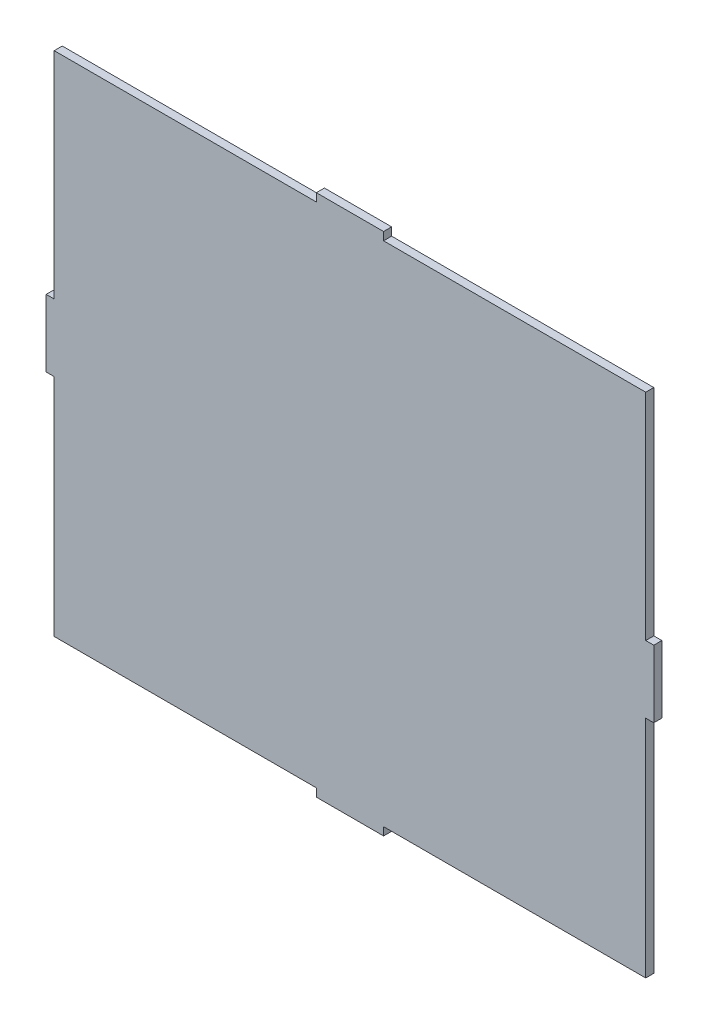
ISO-10303-21;
HEADER;
FILE_DESCRIPTION(('STEP AP214'),'2;1');
FILE_NAME('part.step','',(''),(''),'','','');
FILE_SCHEMA(('AUTOMOTIVE_DESIGN { 1 0 10303 214 1 1 1 1 }'));
ENDSEC;
DATA;
#1=APPLICATION_CONTEXT('core data for automotive mechanical design processes');
#2=APPLICATION_PROTOCOL_DEFINITION('international standard','automotive_design',2000,#1);
#3=PRODUCT_CONTEXT('',#1,'mechanical');
#4=PRODUCT('Part','Part','',(#3));
#5=PRODUCT_RELATED_PRODUCT_CATEGORY('part','',(#4));
#6=PRODUCT_DEFINITION_FORMATION('','',#4);
#7=PRODUCT_DEFINITION_CONTEXT('part definition',#1,'design');
#8=PRODUCT_DEFINITION('design','',#6,#7);
#9=PRODUCT_DEFINITION_SHAPE('','',#8);
#10=(LENGTH_UNIT() NAMED_UNIT(*) SI_UNIT(.MILLI.,.METRE.));
#11=(NAMED_UNIT(*) PLANE_ANGLE_UNIT() SI_UNIT($,.RADIAN.));
#12=(NAMED_UNIT(*) SI_UNIT($,.STERADIAN.) SOLID_ANGLE_UNIT());
#13=UNCERTAINTY_MEASURE_WITH_UNIT(LENGTH_MEASURE(1.E-05),#10,'distance_accuracy_value','');
#14=(GEOMETRIC_REPRESENTATION_CONTEXT(3) GLOBAL_UNCERTAINTY_ASSIGNED_CONTEXT((#13)) GLOBAL_UNIT_ASSIGNED_CONTEXT((#10,
#11,#12)) REPRESENTATION_CONTEXT('',''));
#15=CARTESIAN_POINT('',(0.,0.,0.));
#16=DIRECTION('',(0.,0.,1.));
#17=DIRECTION('',(1.,0.,0.));
#18=AXIS2_PLACEMENT_3D('',#15,#16,#17);
#19=CARTESIAN_POINT('',(-264.990880180926,187.230647896846,3.));
#20=DIRECTION('',(1.,0.,0.));
#21=DIRECTION('',(0.,1.,0.));
#22=AXIS2_PLACEMENT_3D('',#19,#20,#21);
#23=PLANE('',#22);
#24=DIRECTION('',(0.,-1.,0.));
#25=VECTOR('',#24,1.);
#26=CARTESIAN_POINT('',(-264.990880180926,187.230647896846,0.));
#27=LINE('',#26,#25);
#28=CARTESIAN_POINT('',(-264.990880180926,187.230647896846,0.));
#29=VERTEX_POINT('',#28);
#30=CARTESIAN_POINT('',(-264.990880180926,107.230647896846,0.));
#31=VERTEX_POINT('',#30);
#32=EDGE_CURVE('E201',#29,#31,#27,.T.);
#33=ORIENTED_EDGE('',*,*,#32,.T.);
#34=DIRECTION('',(0.,0.,-1.));
#35=VECTOR('',#34,1.);
#36=CARTESIAN_POINT('',(-264.990880180926,107.230647896846,3.));
#37=LINE('',#36,#35);
#38=CARTESIAN_POINT('',(-264.990880180926,107.230647896846,3.));
#39=VERTEX_POINT('',#38);
#40=EDGE_CURVE('E11',#39,#31,#37,.T.);
#41=ORIENTED_EDGE('',*,*,#40,.F.);
#42=DIRECTION('',(0.,-1.,0.));
#43=VECTOR('',#42,1.);
#44=CARTESIAN_POINT('',(-264.990880180926,187.230647896846,3.));
#45=LINE('',#44,#43);
#46=CARTESIAN_POINT('',(-264.990880180926,187.230647896846,3.));
#47=VERTEX_POINT('',#46);
#48=EDGE_CURVE('E239',#47,#39,#45,.T.);
#49=ORIENTED_EDGE('',*,*,#48,.F.);
#50=DIRECTION('',(0.,0.,-1.));
#51=VECTOR('',#50,1.);
#52=CARTESIAN_POINT('',(-264.990880180926,187.230647896846,3.));
#53=LINE('',#52,#51);
#54=EDGE_CURVE('E197',#47,#29,#53,.T.);
#55=ORIENTED_EDGE('',*,*,#54,.T.);
#56=EDGE_LOOP('',(#33,#41,#49,#55));
#57=FACE_BOUND('',#56,.T.);
#58=ADVANCED_FACE('F33',(#57),#23,.F.);
#59=CARTESIAN_POINT('',(-264.990880180926,107.230647896846,3.));
#60=DIRECTION('',(0.,-1.,0.));
#61=DIRECTION('',(0.,0.,-1.));
#62=AXIS2_PLACEMENT_3D('',#59,#60,#61);
#63=PLANE('',#62);
#64=DIRECTION('',(-1.,0.,0.));
#65=VECTOR('',#64,1.);
#66=CARTESIAN_POINT('',(-264.990880180926,107.230647896846,0.));
#67=LINE('',#66,#65);
#68=CARTESIAN_POINT('',(-267.990880180926,107.230647896846,0.));
#69=VERTEX_POINT('',#68);
#70=EDGE_CURVE('E204',#31,#69,#67,.T.);
#71=ORIENTED_EDGE('',*,*,#70,.T.);
#72=DIRECTION('',(0.,0.,-1.));
#73=VECTOR('',#72,1.);
#74=CARTESIAN_POINT('',(-267.990880180926,107.230647896846,3.));
#75=LINE('',#74,#73);
#76=CARTESIAN_POINT('',(-267.990880180926,107.230647896846,3.));
#77=VERTEX_POINT('',#76);
#78=EDGE_CURVE('E41',#77,#69,#75,.T.);
#79=ORIENTED_EDGE('',*,*,#78,.F.);
#80=DIRECTION('',(-1.,0.,0.));
#81=VECTOR('',#80,1.);
#82=CARTESIAN_POINT('',(-264.990880180926,107.230647896846,3.));
#83=LINE('',#82,#81);
#84=EDGE_CURVE('E128',#39,#77,#83,.T.);
#85=ORIENTED_EDGE('',*,*,#84,.F.);
#86=ORIENTED_EDGE('',*,*,#40,.T.);
#87=EDGE_LOOP('',(#71,#79,#85,#86));
#88=FACE_BOUND('',#87,.T.);
#89=ADVANCED_FACE('F357',(#88),#63,.F.);
#90=CARTESIAN_POINT('',(-267.990880180926,107.230647896846,3.));
#91=DIRECTION('',(1.,0.,0.));
#92=DIRECTION('',(0.,0.,-1.));
#93=AXIS2_PLACEMENT_3D('',#90,#91,#92);
#94=PLANE('',#93);
#95=DIRECTION('',(0.,-1.,0.));
#96=VECTOR('',#95,1.);
#97=CARTESIAN_POINT('',(-267.990880180926,107.230647896846,0.));
#98=LINE('',#97,#96);
#99=CARTESIAN_POINT('',(-267.990880180926,82.230647896846,0.));
#100=VERTEX_POINT('',#99);
#101=EDGE_CURVE('E206',#69,#100,#98,.T.);
#102=ORIENTED_EDGE('',*,*,#101,.T.);
#103=DIRECTION('',(0.,0.,-1.));
#104=VECTOR('',#103,1.);
#105=CARTESIAN_POINT('',(-267.990880180926,82.230647896846,3.));
#106=LINE('',#105,#104);
#107=CARTESIAN_POINT('',(-267.990880180926,82.230647896846,3.));
#108=VERTEX_POINT('',#107);
#109=EDGE_CURVE('E282',#108,#100,#106,.T.);
#110=ORIENTED_EDGE('',*,*,#109,.F.);
#111=DIRECTION('',(0.,-1.,0.));
#112=VECTOR('',#111,1.);
#113=CARTESIAN_POINT('',(-267.990880180926,107.230647896846,3.));
#114=LINE('',#113,#112);
#115=EDGE_CURVE('E290',#77,#108,#114,.T.);
#116=ORIENTED_EDGE('',*,*,#115,.F.);
#117=ORIENTED_EDGE('',*,*,#78,.T.);
#118=EDGE_LOOP('',(#102,#110,#116,#117));
#119=FACE_BOUND('',#118,.T.);
#120=ADVANCED_FACE('F288',(#119),#94,.F.);
#121=CARTESIAN_POINT('',(-264.990880180926,82.230647896846,3.));
#122=DIRECTION('',(0.,1.,0.));
#123=DIRECTION('',(0.,0.,1.));
#124=AXIS2_PLACEMENT_3D('',#121,#122,#123);
#125=PLANE('',#124);
#126=DIRECTION('',(1.,0.,0.));
#127=VECTOR('',#126,1.);
#128=CARTESIAN_POINT('',(-264.990880180926,82.230647896846,0.));
#129=LINE('',#128,#127);
#130=CARTESIAN_POINT('',(-264.990880180926,82.230647896846,0.));
#131=VERTEX_POINT('',#130);
#132=EDGE_CURVE('E208',#100,#131,#129,.T.);
#133=ORIENTED_EDGE('',*,*,#132,.T.);
#134=DIRECTION('',(0.,0.,-1.));
#135=VECTOR('',#134,1.);
#136=CARTESIAN_POINT('',(-264.990880180926,82.230647896846,3.));
#137=LINE('',#136,#135);
#138=CARTESIAN_POINT('',(-264.990880180926,82.230647896846,3.));
#139=VERTEX_POINT('',#138);
#140=EDGE_CURVE('E279',#139,#131,#137,.T.);
#141=ORIENTED_EDGE('',*,*,#140,.F.);
#142=DIRECTION('',(1.,0.,0.));
#143=VECTOR('',#142,1.);
#144=CARTESIAN_POINT('',(-264.990880180926,82.230647896846,3.));
#145=LINE('',#144,#143);
#146=EDGE_CURVE('E308',#108,#139,#145,.T.);
#147=ORIENTED_EDGE('',*,*,#146,.F.);
#148=ORIENTED_EDGE('',*,*,#109,.T.);
#149=EDGE_LOOP('',(#133,#141,#147,#148));
#150=FACE_BOUND('',#149,.T.);
#151=ADVANCED_FACE('F299',(#150),#125,.F.);
#152=CARTESIAN_POINT('',(-264.990880180926,82.230647896846,3.));
#153=DIRECTION('',(1.,0.,0.));
#154=DIRECTION('',(0.,0.,-1.));
#155=AXIS2_PLACEMENT_3D('',#152,#153,#154);
#156=PLANE('',#155);
#157=DIRECTION('',(0.,-1.,0.));
#158=VECTOR('',#157,1.);
#159=CARTESIAN_POINT('',(-264.990880180926,82.230647896846,0.));
#160=LINE('',#159,#158);
#161=CARTESIAN_POINT('',(-264.990880180926,-1.46935210315399,0.));
#162=VERTEX_POINT('',#161);
#163=EDGE_CURVE('E210',#131,#162,#160,.T.);
#164=ORIENTED_EDGE('',*,*,#163,.T.);
#165=DIRECTION('',(0.,0.,-1.));
#166=VECTOR('',#165,1.);
#167=CARTESIAN_POINT('',(-264.990880180926,-1.46935210315399,3.));
#168=LINE('',#167,#166);
#169=CARTESIAN_POINT('',(-264.990880180926,-1.46935210315399,3.));
#170=VERTEX_POINT('',#169);
#171=EDGE_CURVE('E276',#170,#162,#168,.T.);
#172=ORIENTED_EDGE('',*,*,#171,.F.);
#173=DIRECTION('',(0.,-1.,0.));
#174=VECTOR('',#173,1.);
#175=CARTESIAN_POINT('',(-264.990880180926,82.230647896846,3.));
#176=LINE('',#175,#174);
#177=EDGE_CURVE('E305',#139,#170,#176,.T.);
#178=ORIENTED_EDGE('',*,*,#177,.F.);
#179=ORIENTED_EDGE('',*,*,#140,.T.);
#180=EDGE_LOOP('',(#164,#172,#178,#179));
#181=FACE_BOUND('',#180,.T.);
#182=ADVANCED_FACE('F303',(#181),#156,.F.);
#183=CARTESIAN_POINT('',(-264.990880180926,-1.46935210315399,3.));
#184=DIRECTION('',(0.,1.,0.));
#185=DIRECTION('',(-1.,0.,0.));
#186=AXIS2_PLACEMENT_3D('',#183,#184,#185);
#187=PLANE('',#186);
#188=DIRECTION('',(1.,0.,0.));
#189=VECTOR('',#188,1.);
#190=CARTESIAN_POINT('',(-264.990880180926,-1.46935210315399,0.));
#191=LINE('',#190,#189);
#192=CARTESIAN_POINT('',(-167.490880180926,-1.46935210315398,0.));
#193=VERTEX_POINT('',#192);
#194=EDGE_CURVE('E212',#162,#193,#191,.T.);
#195=ORIENTED_EDGE('',*,*,#194,.T.);
#196=DIRECTION('',(0.,0.,-1.));
#197=VECTOR('',#196,1.);
#198=CARTESIAN_POINT('',(-167.490880180926,-1.46935210315398,3.));
#199=LINE('',#198,#197);
#200=CARTESIAN_POINT('',(-167.490880180926,-1.46935210315398,3.));
#201=VERTEX_POINT('',#200);
#202=EDGE_CURVE('E273',#201,#193,#199,.T.);
#203=ORIENTED_EDGE('',*,*,#202,.F.);
#204=DIRECTION('',(1.,0.,0.));
#205=VECTOR('',#204,1.);
#206=CARTESIAN_POINT('',(-264.990880180926,-1.46935210315399,3.));
#207=LINE('',#206,#205);
#208=EDGE_CURVE('E307',#170,#201,#207,.T.);
#209=ORIENTED_EDGE('',*,*,#208,.F.);
#210=ORIENTED_EDGE('',*,*,#171,.T.);
#211=EDGE_LOOP('',(#195,#203,#209,#210));
#212=FACE_BOUND('',#211,.T.);
#213=ADVANCED_FACE('F370',(#212),#187,.F.);
#214=CARTESIAN_POINT('',(-167.490880180926,-1.46935210315398,3.));
#215=DIRECTION('',(1.,0.,0.));
#216=DIRECTION('',(0.,0.,-1.));
#217=AXIS2_PLACEMENT_3D('',#214,#215,#216);
#218=PLANE('',#217);
#219=DIRECTION('',(0.,-1.,0.));
#220=VECTOR('',#219,1.);
#221=CARTESIAN_POINT('',(-167.490880180926,-1.46935210315398,0.));
#222=LINE('',#221,#220);
#223=CARTESIAN_POINT('',(-167.490880180926,-4.46935210315397,0.));
#224=VERTEX_POINT('',#223);
#225=EDGE_CURVE('E214',#193,#224,#222,.T.);
#226=ORIENTED_EDGE('',*,*,#225,.T.);
#227=DIRECTION('',(0.,0.,-1.));
#228=VECTOR('',#227,1.);
#229=CARTESIAN_POINT('',(-167.490880180926,-4.46935210315397,3.));
#230=LINE('',#229,#228);
#231=CARTESIAN_POINT('',(-167.490880180926,-4.46935210315397,3.));
#232=VERTEX_POINT('',#231);
#233=EDGE_CURVE('E270',#232,#224,#230,.T.);
#234=ORIENTED_EDGE('',*,*,#233,.F.);
#235=DIRECTION('',(0.,-1.,0.));
#236=VECTOR('',#235,1.);
#237=CARTESIAN_POINT('',(-167.490880180926,-1.46935210315398,3.));
#238=LINE('',#237,#236);
#239=EDGE_CURVE('E310',#201,#232,#238,.T.);
#240=ORIENTED_EDGE('',*,*,#239,.F.);
#241=ORIENTED_EDGE('',*,*,#202,.T.);
#242=EDGE_LOOP('',(#226,#234,#240,#241));
#243=FACE_BOUND('',#242,.T.);
#244=ADVANCED_FACE('F373',(#243),#218,.F.);
#245=CARTESIAN_POINT('',(-167.490880180926,-4.46935210315397,3.));
#246=DIRECTION('',(0.,1.,0.));
#247=DIRECTION('',(0.,0.,1.));
#248=AXIS2_PLACEMENT_3D('',#245,#246,#247);
#249=PLANE('',#248);
#250=DIRECTION('',(1.,0.,0.));
#251=VECTOR('',#250,1.);
#252=CARTESIAN_POINT('',(-167.490880180926,-4.46935210315397,0.));
#253=LINE('',#252,#251);
#254=CARTESIAN_POINT('',(-142.490880180926,-4.46935210315397,0.));
#255=VERTEX_POINT('',#254);
#256=EDGE_CURVE('E216',#224,#255,#253,.T.);
#257=ORIENTED_EDGE('',*,*,#256,.T.);
#258=DIRECTION('',(0.,0.,-1.));
#259=VECTOR('',#258,1.);
#260=CARTESIAN_POINT('',(-142.490880180926,-4.46935210315397,3.));
#261=LINE('',#260,#259);
#262=CARTESIAN_POINT('',(-142.490880180926,-4.46935210315397,3.));
#263=VERTEX_POINT('',#262);
#264=EDGE_CURVE('E267',#263,#255,#261,.T.);
#265=ORIENTED_EDGE('',*,*,#264,.F.);
#266=DIRECTION('',(1.,0.,0.));
#267=VECTOR('',#266,1.);
#268=CARTESIAN_POINT('',(-167.490880180926,-4.46935210315397,3.));
#269=LINE('',#268,#267);
#270=EDGE_CURVE('E316',#232,#263,#269,.T.);
#271=ORIENTED_EDGE('',*,*,#270,.F.);
#272=ORIENTED_EDGE('',*,*,#233,.T.);
#273=EDGE_LOOP('',(#257,#265,#271,#272));
#274=FACE_BOUND('',#273,.T.);
#275=ADVANCED_FACE('F377',(#274),#249,.F.);
#276=CARTESIAN_POINT('',(-142.490880180926,-1.46935210315398,3.));
#277=DIRECTION('',(-1.,0.,0.));
#278=DIRECTION('',(0.,-1.,0.));
#279=AXIS2_PLACEMENT_3D('',#276,#277,#278);
#280=PLANE('',#279);
#281=DIRECTION('',(0.,1.,0.));
#282=VECTOR('',#281,1.);
#283=CARTESIAN_POINT('',(-142.490880180926,-1.46935210315398,0.));
#284=LINE('',#283,#282);
#285=CARTESIAN_POINT('',(-142.490880180926,-1.46935210315398,0.));
#286=VERTEX_POINT('',#285);
#287=EDGE_CURVE('E218',#255,#286,#284,.T.);
#288=ORIENTED_EDGE('',*,*,#287,.T.);
#289=DIRECTION('',(0.,0.,-1.));
#290=VECTOR('',#289,1.);
#291=CARTESIAN_POINT('',(-142.490880180926,-1.46935210315398,3.));
#292=LINE('',#291,#290);
#293=CARTESIAN_POINT('',(-142.490880180926,-1.46935210315398,3.));
#294=VERTEX_POINT('',#293);
#295=EDGE_CURVE('E264',#294,#286,#292,.T.);
#296=ORIENTED_EDGE('',*,*,#295,.F.);
#297=DIRECTION('',(0.,1.,0.));
#298=VECTOR('',#297,1.);
#299=CARTESIAN_POINT('',(-142.490880180926,-1.46935210315398,3.));
#300=LINE('',#299,#298);
#301=EDGE_CURVE('E318',#263,#294,#300,.T.);
#302=ORIENTED_EDGE('',*,*,#301,.F.);
#303=ORIENTED_EDGE('',*,*,#264,.T.);
#304=EDGE_LOOP('',(#288,#296,#302,#303));
#305=FACE_BOUND('',#304,.T.);
#306=ADVANCED_FACE('F381',(#305),#280,.F.);
#307=CARTESIAN_POINT('',(-142.490880180926,-1.46935210315398,3.));
#308=DIRECTION('',(0.,1.,0.));
#309=DIRECTION('',(-1.,0.,0.));
#310=AXIS2_PLACEMENT_3D('',#307,#308,#309);
#311=PLANE('',#310);
#312=DIRECTION('',(1.,0.,0.));
#313=VECTOR('',#312,1.);
#314=CARTESIAN_POINT('',(-142.490880180926,-1.46935210315398,0.));
#315=LINE('',#314,#313);
#316=CARTESIAN_POINT('',(-44.990880180926,-1.46935210315397,0.));
#317=VERTEX_POINT('',#316);
#318=EDGE_CURVE('E220',#286,#317,#315,.T.);
#319=ORIENTED_EDGE('',*,*,#318,.T.);
#320=DIRECTION('',(0.,0.,-1.));
#321=VECTOR('',#320,1.);
#322=CARTESIAN_POINT('',(-44.990880180926,-1.46935210315397,3.));
#323=LINE('',#322,#321);
#324=CARTESIAN_POINT('',(-44.990880180926,-1.46935210315397,3.));
#325=VERTEX_POINT('',#324);
#326=EDGE_CURVE('E261',#325,#317,#323,.T.);
#327=ORIENTED_EDGE('',*,*,#326,.F.);
#328=DIRECTION('',(1.,0.,0.));
#329=VECTOR('',#328,1.);
#330=CARTESIAN_POINT('',(-142.490880180926,-1.46935210315398,3.));
#331=LINE('',#330,#329);
#332=EDGE_CURVE('E320',#294,#325,#331,.T.);
#333=ORIENTED_EDGE('',*,*,#332,.F.);
#334=ORIENTED_EDGE('',*,*,#295,.T.);
#335=EDGE_LOOP('',(#319,#327,#333,#334));
#336=FACE_BOUND('',#335,.T.);
#337=ADVANCED_FACE('F385',(#336),#311,.F.);
#338=CARTESIAN_POINT('',(-44.990880180926,82.230647896846,3.));
#339=DIRECTION('',(-1.,0.,0.));
#340=DIRECTION('',(0.,-1.,0.));
#341=AXIS2_PLACEMENT_3D('',#338,#339,#340);
#342=PLANE('',#341);
#343=DIRECTION('',(0.,1.,0.));
#344=VECTOR('',#343,1.);
#345=CARTESIAN_POINT('',(-44.990880180926,82.230647896846,0.));
#346=LINE('',#345,#344);
#347=CARTESIAN_POINT('',(-44.990880180926,82.230647896846,0.));
#348=VERTEX_POINT('',#347);
#349=EDGE_CURVE('E222',#317,#348,#346,.T.);
#350=ORIENTED_EDGE('',*,*,#349,.T.);
#351=DIRECTION('',(0.,0.,-1.));
#352=VECTOR('',#351,1.);
#353=CARTESIAN_POINT('',(-44.990880180926,82.230647896846,3.));
#354=LINE('',#353,#352);
#355=CARTESIAN_POINT('',(-44.990880180926,82.230647896846,3.));
#356=VERTEX_POINT('',#355);
#357=EDGE_CURVE('E258',#356,#348,#354,.T.);
#358=ORIENTED_EDGE('',*,*,#357,.F.);
#359=DIRECTION('',(0.,1.,0.));
#360=VECTOR('',#359,1.);
#361=CARTESIAN_POINT('',(-44.990880180926,82.230647896846,3.));
#362=LINE('',#361,#360);
#363=EDGE_CURVE('E322',#325,#356,#362,.T.);
#364=ORIENTED_EDGE('',*,*,#363,.F.);
#365=ORIENTED_EDGE('',*,*,#326,.T.);
#366=EDGE_LOOP('',(#350,#358,#364,#365));
#367=FACE_BOUND('',#366,.T.);
#368=ADVANCED_FACE('F389',(#367),#342,.F.);
#369=CARTESIAN_POINT('',(-44.990880180926,82.230647896846,3.));
#370=DIRECTION('',(0.,1.,0.));
#371=DIRECTION('',(0.,0.,1.));
#372=AXIS2_PLACEMENT_3D('',#369,#370,#371);
#373=PLANE('',#372);
#374=DIRECTION('',(1.,0.,0.));
#375=VECTOR('',#374,1.);
#376=CARTESIAN_POINT('',(-44.990880180926,82.230647896846,0.));
#377=LINE('',#376,#375);
#378=CARTESIAN_POINT('',(-41.990880180926,82.230647896846,0.));
#379=VERTEX_POINT('',#378);
#380=EDGE_CURVE('E224',#348,#379,#377,.T.);
#381=ORIENTED_EDGE('',*,*,#380,.T.);
#382=DIRECTION('',(0.,0.,-1.));
#383=VECTOR('',#382,1.);
#384=CARTESIAN_POINT('',(-41.990880180926,82.230647896846,3.));
#385=LINE('',#384,#383);
#386=CARTESIAN_POINT('',(-41.990880180926,82.230647896846,3.));
#387=VERTEX_POINT('',#386);
#388=EDGE_CURVE('E255',#387,#379,#385,.T.);
#389=ORIENTED_EDGE('',*,*,#388,.F.);
#390=DIRECTION('',(1.,0.,0.));
#391=VECTOR('',#390,1.);
#392=CARTESIAN_POINT('',(-44.990880180926,82.230647896846,3.));
#393=LINE('',#392,#391);
#394=EDGE_CURVE('E324',#356,#387,#393,.T.);
#395=ORIENTED_EDGE('',*,*,#394,.F.);
#396=ORIENTED_EDGE('',*,*,#357,.T.);
#397=EDGE_LOOP('',(#381,#389,#395,#396));
#398=FACE_BOUND('',#397,.T.);
#399=ADVANCED_FACE('F393',(#398),#373,.F.);
#400=CARTESIAN_POINT('',(-41.990880180926,107.230647896846,3.));
#401=DIRECTION('',(-1.,0.,0.));
#402=DIRECTION('',(0.,0.,1.));
#403=AXIS2_PLACEMENT_3D('',#400,#401,#402);
#404=PLANE('',#403);
#405=DIRECTION('',(0.,1.,0.));
#406=VECTOR('',#405,1.);
#407=CARTESIAN_POINT('',(-41.990880180926,107.230647896846,0.));
#408=LINE('',#407,#406);
#409=CARTESIAN_POINT('',(-41.990880180926,107.230647896846,0.));
#410=VERTEX_POINT('',#409);
#411=EDGE_CURVE('E226',#379,#410,#408,.T.);
#412=ORIENTED_EDGE('',*,*,#411,.T.);
#413=DIRECTION('',(0.,0.,-1.));
#414=VECTOR('',#413,1.);
#415=CARTESIAN_POINT('',(-41.990880180926,107.230647896846,3.));
#416=LINE('',#415,#414);
#417=CARTESIAN_POINT('',(-41.990880180926,107.230647896846,3.));
#418=VERTEX_POINT('',#417);
#419=EDGE_CURVE('E252',#418,#410,#416,.T.);
#420=ORIENTED_EDGE('',*,*,#419,.F.);
#421=DIRECTION('',(0.,1.,0.));
#422=VECTOR('',#421,1.);
#423=CARTESIAN_POINT('',(-41.990880180926,107.230647896846,3.));
#424=LINE('',#423,#422);
#425=EDGE_CURVE('E326',#387,#418,#424,.T.);
#426=ORIENTED_EDGE('',*,*,#425,.F.);
#427=ORIENTED_EDGE('',*,*,#388,.T.);
#428=EDGE_LOOP('',(#412,#420,#426,#427));
#429=FACE_BOUND('',#428,.T.);
#430=ADVANCED_FACE('F397',(#429),#404,.F.);
#431=CARTESIAN_POINT('',(-44.990880180926,107.230647896846,3.));
#432=DIRECTION('',(0.,-1.,0.));
#433=DIRECTION('',(0.,0.,-1.));
#434=AXIS2_PLACEMENT_3D('',#431,#432,#433);
#435=PLANE('',#434);
#436=DIRECTION('',(-1.,0.,0.));
#437=VECTOR('',#436,1.);
#438=CARTESIAN_POINT('',(-44.990880180926,107.230647896846,0.));
#439=LINE('',#438,#437);
#440=CARTESIAN_POINT('',(-44.990880180926,107.230647896846,0.));
#441=VERTEX_POINT('',#440);
#442=EDGE_CURVE('E228',#410,#441,#439,.T.);
#443=ORIENTED_EDGE('',*,*,#442,.T.);
#444=DIRECTION('',(0.,0.,-1.));
#445=VECTOR('',#444,1.);
#446=CARTESIAN_POINT('',(-44.990880180926,107.230647896846,3.));
#447=LINE('',#446,#445);
#448=CARTESIAN_POINT('',(-44.990880180926,107.230647896846,3.));
#449=VERTEX_POINT('',#448);
#450=EDGE_CURVE('E249',#449,#441,#447,.T.);
#451=ORIENTED_EDGE('',*,*,#450,.F.);
#452=DIRECTION('',(-1.,0.,0.));
#453=VECTOR('',#452,1.);
#454=CARTESIAN_POINT('',(-44.990880180926,107.230647896846,3.));
#455=LINE('',#454,#453);
#456=EDGE_CURVE('E328',#418,#449,#455,.T.);
#457=ORIENTED_EDGE('',*,*,#456,.F.);
#458=ORIENTED_EDGE('',*,*,#419,.T.);
#459=EDGE_LOOP('',(#443,#451,#457,#458));
#460=FACE_BOUND('',#459,.T.);
#461=ADVANCED_FACE('F401',(#460),#435,.F.);
#462=CARTESIAN_POINT('',(-44.9908801809261,187.230647896846,3.));
#463=DIRECTION('',(-1.,0.,0.));
#464=DIRECTION('',(0.,-1.,0.));
#465=AXIS2_PLACEMENT_3D('',#462,#463,#464);
#466=PLANE('',#465);
#467=DIRECTION('',(0.,1.,0.));
#468=VECTOR('',#467,1.);
#469=CARTESIAN_POINT('',(-44.9908801809261,187.230647896846,0.));
#470=LINE('',#469,#468);
#471=CARTESIAN_POINT('',(-44.9908801809261,187.230647896846,0.));
#472=VERTEX_POINT('',#471);
#473=EDGE_CURVE('E230',#441,#472,#470,.T.);
#474=ORIENTED_EDGE('',*,*,#473,.T.);
#475=DIRECTION('',(0.,0.,-1.));
#476=VECTOR('',#475,1.);
#477=CARTESIAN_POINT('',(-44.9908801809261,187.230647896846,3.));
#478=LINE('',#477,#476);
#479=CARTESIAN_POINT('',(-44.9908801809261,187.230647896846,3.));
#480=VERTEX_POINT('',#479);
#481=EDGE_CURVE('E246',#480,#472,#478,.T.);
#482=ORIENTED_EDGE('',*,*,#481,.F.);
#483=DIRECTION('',(0.,1.,0.));
#484=VECTOR('',#483,1.);
#485=CARTESIAN_POINT('',(-44.9908801809261,187.230647896846,3.));
#486=LINE('',#485,#484);
#487=EDGE_CURVE('E330',#449,#480,#486,.T.);
#488=ORIENTED_EDGE('',*,*,#487,.F.);
#489=ORIENTED_EDGE('',*,*,#450,.T.);
#490=EDGE_LOOP('',(#474,#482,#488,#489));
#491=FACE_BOUND('',#490,.T.);
#492=ADVANCED_FACE('F405',(#491),#466,.F.);
#493=CARTESIAN_POINT('',(-142.490880180926,187.230647896846,3.));
#494=DIRECTION('',(0.,-1.,0.));
#495=DIRECTION('',(0.,0.,-1.));
#496=AXIS2_PLACEMENT_3D('',#493,#494,#495);
#497=PLANE('',#496);
#498=DIRECTION('',(-1.,0.,0.));
#499=VECTOR('',#498,1.);
#500=CARTESIAN_POINT('',(-142.490880180926,187.230647896846,0.));
#501=LINE('',#500,#499);
#502=CARTESIAN_POINT('',(-142.490880180926,187.230647896846,0.));
#503=VERTEX_POINT('',#502);
#504=EDGE_CURVE('E232',#472,#503,#501,.T.);
#505=ORIENTED_EDGE('',*,*,#504,.T.);
#506=DIRECTION('',(0.,0.,-1.));
#507=VECTOR('',#506,1.);
#508=CARTESIAN_POINT('',(-142.490880180926,187.230647896846,3.));
#509=LINE('',#508,#507);
#510=CARTESIAN_POINT('',(-142.490880180926,187.230647896846,3.));
#511=VERTEX_POINT('',#510);
#512=EDGE_CURVE('E243',#511,#503,#509,.T.);
#513=ORIENTED_EDGE('',*,*,#512,.F.);
#514=DIRECTION('',(-1.,0.,0.));
#515=VECTOR('',#514,1.);
#516=CARTESIAN_POINT('',(-142.490880180926,187.230647896846,3.));
#517=LINE('',#516,#515);
#518=EDGE_CURVE('E332',#480,#511,#517,.T.);
#519=ORIENTED_EDGE('',*,*,#518,.F.);
#520=ORIENTED_EDGE('',*,*,#481,.T.);
#521=EDGE_LOOP('',(#505,#513,#519,#520));
#522=FACE_BOUND('',#521,.T.);
#523=ADVANCED_FACE('F338',(#522),#497,.F.);
#524=CARTESIAN_POINT('',(-142.490880180926,187.230647896846,3.));
#525=DIRECTION('',(-1.,0.,0.));
#526=DIRECTION('',(0.,0.,1.));
#527=AXIS2_PLACEMENT_3D('',#524,#525,#526);
#528=PLANE('',#527);
#529=DIRECTION('',(0.,1.,0.));
#530=VECTOR('',#529,1.);
#531=CARTESIAN_POINT('',(-142.490880180926,187.230647896846,0.));
#532=LINE('',#531,#530);
#533=CARTESIAN_POINT('',(-142.490880180926,190.230647896846,0.));
#534=VERTEX_POINT('',#533);
#535=EDGE_CURVE('E234',#503,#534,#532,.T.);
#536=ORIENTED_EDGE('',*,*,#535,.T.);
#537=DIRECTION('',(0.,0.,-1.));
#538=VECTOR('',#537,1.);
#539=CARTESIAN_POINT('',(-142.490880180926,190.230647896846,3.));
#540=LINE('',#539,#538);
#541=CARTESIAN_POINT('',(-142.490880180926,190.230647896846,3.));
#542=VERTEX_POINT('',#541);
#543=EDGE_CURVE('E192',#542,#534,#540,.T.);
#544=ORIENTED_EDGE('',*,*,#543,.F.);
#545=DIRECTION('',(0.,1.,0.));
#546=VECTOR('',#545,1.);
#547=CARTESIAN_POINT('',(-142.490880180926,187.230647896846,3.));
#548=LINE('',#547,#546);
#549=EDGE_CURVE('E183',#511,#542,#548,.T.);
#550=ORIENTED_EDGE('',*,*,#549,.F.);
#551=ORIENTED_EDGE('',*,*,#512,.T.);
#552=EDGE_LOOP('',(#536,#544,#550,#551));
#553=FACE_BOUND('',#552,.T.);
#554=ADVANCED_FACE('F342',(#553),#528,.F.);
#555=CARTESIAN_POINT('',(-167.490880180926,190.230647896846,3.));
#556=DIRECTION('',(0.,-1.,0.));
#557=DIRECTION('',(0.,0.,-1.));
#558=AXIS2_PLACEMENT_3D('',#555,#556,#557);
#559=PLANE('',#558);
#560=DIRECTION('',(-1.,0.,0.));
#561=VECTOR('',#560,1.);
#562=CARTESIAN_POINT('',(-167.490880180926,190.230647896846,0.));
#563=LINE('',#562,#561);
#564=CARTESIAN_POINT('',(-167.490880180926,190.230647896846,0.));
#565=VERTEX_POINT('',#564);
#566=EDGE_CURVE('E191',#534,#565,#563,.T.);
#567=ORIENTED_EDGE('',*,*,#566,.T.);
#568=DIRECTION('',(0.,0.,-1.));
#569=VECTOR('',#568,1.);
#570=CARTESIAN_POINT('',(-167.490880180926,190.230647896846,3.));
#571=LINE('',#570,#569);
#572=CARTESIAN_POINT('',(-167.490880180926,190.230647896846,3.));
#573=VERTEX_POINT('',#572);
#574=EDGE_CURVE('E188',#573,#565,#571,.T.);
#575=ORIENTED_EDGE('',*,*,#574,.F.);
#576=DIRECTION('',(-1.,0.,0.));
#577=VECTOR('',#576,1.);
#578=CARTESIAN_POINT('',(-167.490880180926,190.230647896846,3.));
#579=LINE('',#578,#577);
#580=EDGE_CURVE('E177',#542,#573,#579,.T.);
#581=ORIENTED_EDGE('',*,*,#580,.F.);
#582=ORIENTED_EDGE('',*,*,#543,.T.);
#583=EDGE_LOOP('',(#567,#575,#581,#582));
#584=FACE_BOUND('',#583,.T.);
#585=ADVANCED_FACE('F189',(#584),#559,.F.);
#586=CARTESIAN_POINT('',(-167.490880180926,187.230647896846,3.));
#587=DIRECTION('',(1.,0.,0.));
#588=DIRECTION('',(0.,0.,-1.));
#589=AXIS2_PLACEMENT_3D('',#586,#587,#588);
#590=PLANE('',#589);
#591=DIRECTION('',(0.,-1.,0.));
#592=VECTOR('',#591,1.);
#593=CARTESIAN_POINT('',(-167.490880180926,187.230647896846,0.));
#594=LINE('',#593,#592);
#595=CARTESIAN_POINT('',(-167.490880180926,187.230647896846,0.));
#596=VERTEX_POINT('',#595);
#597=EDGE_CURVE('E114',#565,#596,#594,.T.);
#598=ORIENTED_EDGE('',*,*,#597,.T.);
#599=DIRECTION('',(0.,0.,-1.));
#600=VECTOR('',#599,1.);
#601=CARTESIAN_POINT('',(-167.490880180926,187.230647896846,3.));
#602=LINE('',#601,#600);
#603=CARTESIAN_POINT('',(-167.490880180926,187.230647896846,3.));
#604=VERTEX_POINT('',#603);
#605=EDGE_CURVE('E193',#604,#596,#602,.T.);
#606=ORIENTED_EDGE('',*,*,#605,.F.);
#607=DIRECTION('',(0.,-1.,0.));
#608=VECTOR('',#607,1.);
#609=CARTESIAN_POINT('',(-167.490880180926,187.230647896846,3.));
#610=LINE('',#609,#608);
#611=EDGE_CURVE('E181',#573,#604,#610,.T.);
#612=ORIENTED_EDGE('',*,*,#611,.F.);
#613=ORIENTED_EDGE('',*,*,#574,.T.);
#614=EDGE_LOOP('',(#598,#606,#612,#613));
#615=FACE_BOUND('',#614,.T.);
#616=ADVANCED_FACE('F195',(#615),#590,.F.);
#617=CARTESIAN_POINT('',(-264.990880180926,187.230647896846,3.));
#618=DIRECTION('',(0.,-1.,0.));
#619=DIRECTION('',(0.,0.,-1.));
#620=AXIS2_PLACEMENT_3D('',#617,#618,#619);
#621=PLANE('',#620);
#622=DIRECTION('',(-1.,0.,0.));
#623=VECTOR('',#622,1.);
#624=CARTESIAN_POINT('',(-264.990880180926,187.230647896846,0.));
#625=LINE('',#624,#623);
#626=EDGE_CURVE('E120',#596,#29,#625,.T.);
#627=ORIENTED_EDGE('',*,*,#626,.T.);
#628=ORIENTED_EDGE('',*,*,#54,.F.);
#629=DIRECTION('',(-1.,0.,0.));
#630=VECTOR('',#629,1.);
#631=CARTESIAN_POINT('',(-264.990880180926,187.230647896846,3.));
#632=LINE('',#631,#630);
#633=EDGE_CURVE('E49',#604,#47,#632,.T.);
#634=ORIENTED_EDGE('',*,*,#633,.F.);
#635=ORIENTED_EDGE('',*,*,#605,.T.);
#636=EDGE_LOOP('',(#627,#628,#634,#635));
#637=FACE_BOUND('',#636,.T.);
#638=ADVANCED_FACE('F346',(#637),#621,.F.);
#639=CARTESIAN_POINT('',(0.,0.,3.));
#640=DIRECTION('',(0.,0.,-1.));
#641=DIRECTION('',(-1.,0.,0.));
#642=AXIS2_PLACEMENT_3D('',#639,#640,#641);
#643=PLANE('',#642);
#644=ORIENTED_EDGE('',*,*,#48,.T.);
#645=ORIENTED_EDGE('',*,*,#84,.T.);
#646=ORIENTED_EDGE('',*,*,#115,.T.);
#647=ORIENTED_EDGE('',*,*,#146,.T.);
#648=ORIENTED_EDGE('',*,*,#177,.T.);
#649=ORIENTED_EDGE('',*,*,#208,.T.);
#650=ORIENTED_EDGE('',*,*,#239,.T.);
#651=ORIENTED_EDGE('',*,*,#270,.T.);
#652=ORIENTED_EDGE('',*,*,#301,.T.);
#653=ORIENTED_EDGE('',*,*,#332,.T.);
#654=ORIENTED_EDGE('',*,*,#363,.T.);
#655=ORIENTED_EDGE('',*,*,#394,.T.);
#656=ORIENTED_EDGE('',*,*,#425,.T.);
#657=ORIENTED_EDGE('',*,*,#456,.T.);
#658=ORIENTED_EDGE('',*,*,#487,.T.);
#659=ORIENTED_EDGE('',*,*,#518,.T.);
#660=ORIENTED_EDGE('',*,*,#549,.T.);
#661=ORIENTED_EDGE('',*,*,#580,.T.);
#662=ORIENTED_EDGE('',*,*,#611,.T.);
#663=ORIENTED_EDGE('',*,*,#633,.T.);
#664=EDGE_LOOP('',(#644,#645,#646,#647,#648,#649,#650,#651,#652,#653,#654,#655,#656,#657,#658,
#659,#660,#661,#662,#663));
#665=FACE_BOUND('',#664,.T.);
#666=ADVANCED_FACE('F179',(#665),#643,.F.);
#667=CARTESIAN_POINT('',(0.,0.,0.));
#668=DIRECTION('',(0.,0.,-1.));
#669=DIRECTION('',(-1.,0.,0.));
#670=AXIS2_PLACEMENT_3D('',#667,#668,#669);
#671=PLANE('',#670);
#672=ORIENTED_EDGE('',*,*,#32,.F.);
#673=ORIENTED_EDGE('',*,*,#626,.F.);
#674=ORIENTED_EDGE('',*,*,#597,.F.);
#675=ORIENTED_EDGE('',*,*,#566,.F.);
#676=ORIENTED_EDGE('',*,*,#535,.F.);
#677=ORIENTED_EDGE('',*,*,#504,.F.);
#678=ORIENTED_EDGE('',*,*,#473,.F.);
#679=ORIENTED_EDGE('',*,*,#442,.F.);
#680=ORIENTED_EDGE('',*,*,#411,.F.);
#681=ORIENTED_EDGE('',*,*,#380,.F.);
#682=ORIENTED_EDGE('',*,*,#349,.F.);
#683=ORIENTED_EDGE('',*,*,#318,.F.);
#684=ORIENTED_EDGE('',*,*,#287,.F.);
#685=ORIENTED_EDGE('',*,*,#256,.F.);
#686=ORIENTED_EDGE('',*,*,#225,.F.);
#687=ORIENTED_EDGE('',*,*,#194,.F.);
#688=ORIENTED_EDGE('',*,*,#163,.F.);
#689=ORIENTED_EDGE('',*,*,#132,.F.);
#690=ORIENTED_EDGE('',*,*,#101,.F.);
#691=ORIENTED_EDGE('',*,*,#70,.F.);
#692=EDGE_LOOP('',(#672,#673,#674,#675,#676,#677,#678,#679,#680,#681,#682,#683,#684,#685,#686,
#687,#688,#689,#690,#691));
#693=FACE_BOUND('',#692,.T.);
#694=ADVANCED_FACE('F294',(#693),#671,.T.);
#695=CLOSED_SHELL('',(#58,#89,#120,#151,#182,#213,#244,#275,#306,#337,#368,#399,#430,#461,#492,
#523,#554,#585,#616,#638,#666,#694));
#696=MANIFOLD_SOLID_BREP('B2',#695);
#697=ADVANCED_BREP_SHAPE_REPRESENTATION('',(#18,#696),#14);
#698=SHAPE_DEFINITION_REPRESENTATION(#9,#697);
ENDSEC;
END-ISO-10303-21;
